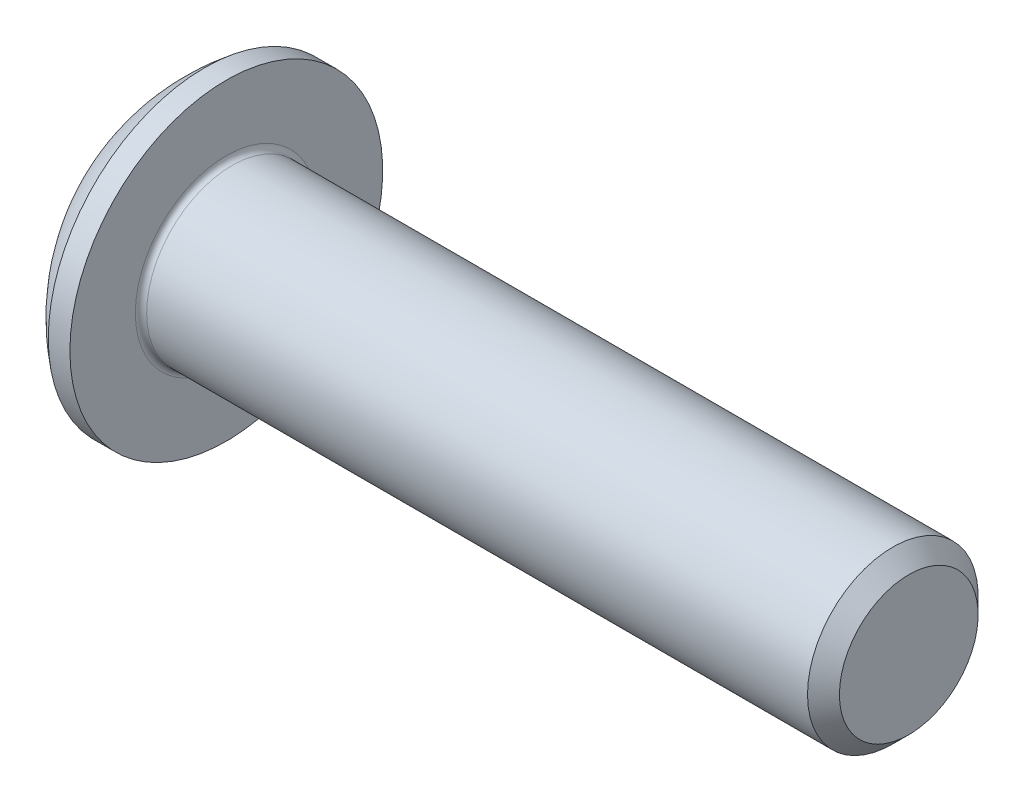
ISO-10303-21;
HEADER;
FILE_DESCRIPTION(('STEP AP214'),'2;1');
FILE_NAME('part.step','',(''),(''),'','','');
FILE_SCHEMA(('AUTOMOTIVE_DESIGN { 1 0 10303 214 1 1 1 1 }'));
ENDSEC;
DATA;
#1=APPLICATION_CONTEXT('core data for automotive mechanical design processes');
#2=APPLICATION_PROTOCOL_DEFINITION('international standard','automotive_design',2000,#1);
#3=PRODUCT_CONTEXT('',#1,'mechanical');
#4=PRODUCT('Part','Part','',(#3));
#5=PRODUCT_RELATED_PRODUCT_CATEGORY('part','',(#4));
#6=PRODUCT_DEFINITION_FORMATION('','',#4);
#7=PRODUCT_DEFINITION_CONTEXT('part definition',#1,'design');
#8=PRODUCT_DEFINITION('design','',#6,#7);
#9=PRODUCT_DEFINITION_SHAPE('','',#8);
#10=(LENGTH_UNIT() NAMED_UNIT(*) SI_UNIT(.MILLI.,.METRE.));
#11=(NAMED_UNIT(*) PLANE_ANGLE_UNIT() SI_UNIT($,.RADIAN.));
#12=(NAMED_UNIT(*) SI_UNIT($,.STERADIAN.) SOLID_ANGLE_UNIT());
#13=UNCERTAINTY_MEASURE_WITH_UNIT(LENGTH_MEASURE(1.E-05),#10,'distance_accuracy_value','');
#14=(GEOMETRIC_REPRESENTATION_CONTEXT(3) GLOBAL_UNCERTAINTY_ASSIGNED_CONTEXT((#13)) GLOBAL_UNIT_ASSIGNED_CONTEXT((#10,
#11,#12)) REPRESENTATION_CONTEXT('',''));
#15=CARTESIAN_POINT('',(0.,0.,0.));
#16=DIRECTION('',(0.,0.,1.));
#17=DIRECTION('',(1.,0.,0.));
#18=AXIS2_PLACEMENT_3D('',#15,#16,#17);
#19=CARTESIAN_POINT('',(0.,0.,0.));
#20=DIRECTION('',(-1.,0.,0.));
#21=DIRECTION('',(0.,0.,1.));
#22=AXIS2_PLACEMENT_3D('',#19,#20,#21);
#23=PLANE('',#22);
#24=CARTESIAN_POINT('',(0.,0.,0.));
#25=DIRECTION('',(-1.,0.,0.));
#26=DIRECTION('',(0.,0.,1.));
#27=AXIS2_PLACEMENT_3D('',#24,#25,#26);
#28=CIRCLE('',#27,1.375);
#29=CARTESIAN_POINT('',(0.,1.375,0.));
#30=VERTEX_POINT('',#29);
#31=EDGE_CURVE('E156',#30,#30,#28,.T.);
#32=ORIENTED_EDGE('',*,*,#31,.T.);
#33=EDGE_LOOP('',(#32));
#34=FACE_BOUND('',#33,.T.);
#35=DIRECTION('',(0.,-1.,0.));
#36=VECTOR('',#35,1.);
#37=CARTESIAN_POINT('',(0.,-0.577350269189625,0.999999999999998));
#38=LINE('',#37,#36);
#39=CARTESIAN_POINT('',(0.,0.577350269189628,1.));
#40=VERTEX_POINT('',#39);
#41=CARTESIAN_POINT('',(0.,-0.577350269189625,0.999999999999998));
#42=VERTEX_POINT('',#41);
#43=EDGE_CURVE('E51',#40,#42,#38,.T.);
#44=ORIENTED_EDGE('',*,*,#43,.T.);
#45=DIRECTION('',(0.,-0.499999999999999,-0.866025403784439));
#46=VECTOR('',#45,1.);
#47=CARTESIAN_POINT('',(0.,-1.15470053837925,0.));
#48=LINE('',#47,#46);
#49=CARTESIAN_POINT('',(0.,-1.15470053837925,0.));
#50=VERTEX_POINT('',#49);
#51=EDGE_CURVE('E276',#42,#50,#48,.T.);
#52=ORIENTED_EDGE('',*,*,#51,.T.);
#53=DIRECTION('',(0.,0.499999999999997,-0.86602540378444));
#54=VECTOR('',#53,1.);
#55=CARTESIAN_POINT('',(0.,-0.577350269189626,-1.));
#56=LINE('',#55,#54);
#57=CARTESIAN_POINT('',(0.,-0.577350269189626,-1.));
#58=VERTEX_POINT('',#57);
#59=EDGE_CURVE('E131',#50,#58,#56,.T.);
#60=ORIENTED_EDGE('',*,*,#59,.T.);
#61=DIRECTION('',(0.,1.,0.));
#62=VECTOR('',#61,1.);
#63=CARTESIAN_POINT('',(0.,0.577350269189628,-1.));
#64=LINE('',#63,#62);
#65=CARTESIAN_POINT('',(0.,0.577350269189628,-1.));
#66=VERTEX_POINT('',#65);
#67=EDGE_CURVE('E279',#58,#66,#64,.T.);
#68=ORIENTED_EDGE('',*,*,#67,.T.);
#69=DIRECTION('',(0.,0.499999999999998,0.866025403784439));
#70=VECTOR('',#69,1.);
#71=CARTESIAN_POINT('',(0.,1.15470053837925,0.));
#72=LINE('',#71,#70);
#73=CARTESIAN_POINT('',(0.,1.15470053837925,0.));
#74=VERTEX_POINT('',#73);
#75=EDGE_CURVE('E281',#66,#74,#72,.T.);
#76=ORIENTED_EDGE('',*,*,#75,.T.);
#77=DIRECTION('',(0.,-0.499999999999998,0.866025403784439));
#78=VECTOR('',#77,1.);
#79=CARTESIAN_POINT('',(0.,0.577350269189628,1.));
#80=LINE('',#79,#78);
#81=EDGE_CURVE('E283',#74,#40,#80,.T.);
#82=ORIENTED_EDGE('',*,*,#81,.T.);
#83=EDGE_LOOP('',(#44,#52,#60,#68,#76,#82));
#84=FACE_BOUND('',#83,.T.);
#85=ADVANCED_FACE('F36',(#34,#84),#23,.T.);
#86=CARTESIAN_POINT('',(3.18540887850468,0.,0.));
#87=DIRECTION('',(-1.,0.,0.));
#88=DIRECTION('',(0.,1.,0.));
#89=AXIS2_PLACEMENT_3D('',#86,#87,#88);
#90=SPHERICAL_SURFACE('',#89,3.46950352691223);
#91=CARTESIAN_POINT('',(1.07,0.,0.));
#92=DIRECTION('',(-1.,0.,0.));
#93=DIRECTION('',(0.,0.,1.));
#94=AXIS2_PLACEMENT_3D('',#91,#92,#93);
#95=CIRCLE('',#94,2.75);
#96=CARTESIAN_POINT('',(1.07,2.75,0.));
#97=VERTEX_POINT('',#96);
#98=EDGE_CURVE('E153',#97,#97,#95,.T.);
#99=CARTESIAN_POINT('',(1.07,2.75,0.));
#100=CARTESIAN_POINT('',(1.05545935022617,2.73881477308308,0.));
#101=CARTESIAN_POINT('',(1.04100742949541,2.72751420032559,0.));
#102=CARTESIAN_POINT('',(1.01228464649899,2.70468525171978,0.));
#103=CARTESIAN_POINT('',(0.998013784233334,2.69315687587146,0.));
#104=CARTESIAN_POINT('',(0.969656718546075,2.66987520967427,0.));
#105=CARTESIAN_POINT('',(0.955570515124477,2.65812191932541,0.));
#106=CARTESIAN_POINT('',(0.927586308834586,2.63439338466757,0.));
#107=CARTESIAN_POINT('',(0.913688305966292,2.62241814035859,0.));
#108=CARTESIAN_POINT('',(0.886083998409159,2.59824871005243,0.));
#109=CARTESIAN_POINT('',(0.872377693720318,2.58605452405526,0.));
#110=CARTESIAN_POINT('',(0.845160231037836,2.56145027883613,0.));
#111=CARTESIAN_POINT('',(0.831649073044194,2.54904021961419,0.));
#112=CARTESIAN_POINT('',(0.804825303401008,2.52400735043028,0.));
#113=CARTESIAN_POINT('',(0.791512691751464,2.51138454046831,0.));
#114=CARTESIAN_POINT('',(0.765089364425369,2.48592934589937,0.));
#115=CARTESIAN_POINT('',(0.751978648748819,2.47309696129241,0.));
#116=CARTESIAN_POINT('',(0.725962412214573,2.44722584623923,0.));
#117=CARTESIAN_POINT('',(0.713056891356878,2.43418711579303,0.));
#118=CARTESIAN_POINT('',(0.687454291671755,2.40790658979237,0.));
#119=CARTESIAN_POINT('',(0.674757212844327,2.39466479423792,0.));
#120=CARTESIAN_POINT('',(0.649574691985387,2.36798146984431,0.));
#121=CARTESIAN_POINT('',(0.637089249953874,2.35453994100515,0.));
#122=CARTESIAN_POINT('',(0.612333144201262,2.3274605321218,0.));
#123=CARTESIAN_POINT('',(0.600062480480163,2.31382265207761,0.));
#124=CARTESIAN_POINT('',(0.57573901882169,2.28635397226851,0.));
#125=CARTESIAN_POINT('',(0.563686220884316,2.2725231725036,0.));
#126=CARTESIAN_POINT('',(0.539801523448456,2.24467213327876,0.));
#127=CARTESIAN_POINT('',(0.527969623949971,2.23065189381883,0.));
#128=CARTESIAN_POINT('',(0.504529700465872,2.20242550289534,0.));
#129=CARTESIAN_POINT('',(0.49292167648026,2.18821935143178,0.));
#130=CARTESIAN_POINT('',(0.469932424765629,2.15962471097054,0.));
#131=CARTESIAN_POINT('',(0.458551197036611,2.14523622197286,0.));
#132=CARTESIAN_POINT('',(0.436018401513735,2.1162805267916,0.));
#133=CARTESIAN_POINT('',(0.424866833719877,2.10171332060801,0.));
#134=CARTESIAN_POINT('',(0.402796163960182,2.07240385637093,0.));
#135=CARTESIAN_POINT('',(0.391877061994345,2.05766159831744,0.));
#136=CARTESIAN_POINT('',(0.37027407129185,2.02800573970208,0.));
#137=CARTESIAN_POINT('',(0.359590182555192,2.01309213914022,0.));
#138=CARTESIAN_POINT('',(0.338460306529221,1.98309734798187,0.));
#139=CARTESIAN_POINT('',(0.328014319239908,1.96801615738538,0.));
#140=CARTESIAN_POINT('',(0.307362874467419,1.93768998079955,0.));
#141=CARTESIAN_POINT('',(0.297157416984243,1.92244499481021,0.));
#142=CARTESIAN_POINT('',(0.276989599662068,1.89179506329372,0.));
#143=CARTESIAN_POINT('',(0.26702723982307,1.87639011776656,0.));
#144=CARTESIAN_POINT('',(0.2473481244606,1.84542414327752,0.));
#145=CARTESIAN_POINT('',(0.237631368937128,1.82986311431563,0.));
#146=CARTESIAN_POINT('',(0.218445907079049,1.7985888883332,0.));
#147=CARTESIAN_POINT('',(0.208977200744443,1.78287569131266,0.));
#148=CARTESIAN_POINT('',(0.190290219726508,1.75130108287588,0.));
#149=CARTESIAN_POINT('',(0.18107194504318,1.73543967145964,0.));
#150=CARTESIAN_POINT('',(0.162888146771434,1.70357262519023,0.));
#151=CARTESIAN_POINT('',(0.153922623183016,1.68756699033706,0.));
#152=CARTESIAN_POINT('',(0.136246582973665,1.6554155244301,0.));
#153=CARTESIAN_POINT('',(0.12753606635273,1.6392696933763,0.));
#154=CARTESIAN_POINT('',(0.11037223169534,1.60684189762129,0.));
#155=CARTESIAN_POINT('',(0.101918913658883,1.59055993292007,0.));
#156=CARTESIAN_POINT('',(0.0852716034167274,1.55786396652153,0.));
#157=CARTESIAN_POINT('',(0.0770776112110277,1.54144996482421,0.));
#158=CARTESIAN_POINT('',(0.0609510133424006,1.50849405488582,0.));
#159=CARTESIAN_POINT('',(0.0530184076794733,1.49195214664476,0.));
#160=CARTESIAN_POINT('',(0.0374165826325399,1.45874458409474,0.));
#161=CARTESIAN_POINT('',(0.0297473632485339,1.44207892978578,0.));
#162=CARTESIAN_POINT('',(0.0146742263372598,1.40862807477189,0.));
#163=CARTESIAN_POINT('',(0.00727030880999163,1.39184287406696,0.));
#164=CARTESIAN_POINT('',(0.,1.375,0.));
#165=B_SPLINE_CURVE_WITH_KNOTS('',3,(#99,#100,#101,#102,#103,#104,#105,#106,#107,#108,#109,#110,
#111,#112,#113,#114,#115,#116,#117,#118,#119,#120,#121,#122,#123,#124,#125,#126,#127,#128,#129,
#130,#131,#132,#133,#134,#135,#136,#137,#138,#139,#140,#141,#142,#143,#144,#145,#146,#147,#148,
#149,#150,#151,#152,#153,#154,#155,#156,#157,#158,#159,#160,#161,#162,#163,#164),.UNSPECIFIED.,
.F.,.F.,(4,2,2,2,2,2,2,2,2,2,2,2,2,2,2,2,2,2,2,2,2,2,2,2,2,2,2,2,2,2,2,2,4),(0.,
0.055034485525685,0.110068971051371,0.165103456577055,0.22013794210274,0.275172427628426,
0.33020691315411,0.385241398679796,0.440275884205481,0.495310369731166,0.550344855256851,
0.605379340782536,0.660413826308221,0.715448311833906,0.770482797359591,0.825517282885276,
0.880551768410962,0.935586253936647,0.990620739462332,1.04565522498802,1.1006897105137,
1.15572419603939,1.21075868156507,1.26579316709076,1.32082765261644,1.37586213814213,
1.43089662366781,1.4859311091935,1.54096559471918,1.59600008024487,1.65103456577055,
1.70606905129624,1.76110353682192),.UNSPECIFIED.);
#166=EDGE_CURVE('BSEAM177',#97,#30,#165,.T.);
#167=ORIENTED_EDGE('',*,*,#98,.T.);
#168=ORIENTED_EDGE('',*,*,#31,.F.);
#169=ORIENTED_EDGE('',*,*,#166,.T.);
#170=ORIENTED_EDGE('',*,*,#166,.F.);
#171=EDGE_LOOP('',(#167,#169,#168,#170));
#172=FACE_BOUND('',#171,.T.);
#173=ADVANCED_FACE('F177',(#172),#90,.T.);
#174=CARTESIAN_POINT('',(0.,0.,0.));
#175=DIRECTION('',(-1.,0.,0.));
#176=DIRECTION('',(0.,0.,1.));
#177=AXIS2_PLACEMENT_3D('',#174,#175,#176);
#178=CYLINDRICAL_SURFACE('',#177,2.75);
#179=ORIENTED_EDGE('',*,*,#98,.F.);
#180=EDGE_LOOP('',(#179));
#181=FACE_BOUND('',#180,.T.);
#182=CARTESIAN_POINT('',(1.45,0.,0.));
#183=DIRECTION('',(-1.,0.,0.));
#184=DIRECTION('',(0.,0.,1.));
#185=AXIS2_PLACEMENT_3D('',#182,#183,#184);
#186=CIRCLE('',#185,2.75);
#187=CARTESIAN_POINT('',(1.45,0.,2.75));
#188=VERTEX_POINT('',#187);
#189=EDGE_CURVE('E150',#188,#188,#186,.T.);
#190=ORIENTED_EDGE('',*,*,#189,.T.);
#191=EDGE_LOOP('',(#190));
#192=FACE_BOUND('',#191,.T.);
#193=ADVANCED_FACE('F182',(#181,#192),#178,.T.);
#194=CARTESIAN_POINT('',(1.45,1.5,0.));
#195=DIRECTION('',(-1.,0.,0.));
#196=DIRECTION('',(0.,0.,1.));
#197=AXIS2_PLACEMENT_3D('',#194,#195,#196);
#198=PLANE('',#197);
#199=CARTESIAN_POINT('',(1.45,0.,0.));
#200=DIRECTION('',(-1.,0.,0.));
#201=DIRECTION('',(0.,0.,1.));
#202=AXIS2_PLACEMENT_3D('',#199,#200,#201);
#203=CIRCLE('',#202,1.6);
#204=CARTESIAN_POINT('',(1.45,0.,1.6));
#205=VERTEX_POINT('',#204);
#206=EDGE_CURVE('E44',#205,#205,#203,.T.);
#207=ORIENTED_EDGE('',*,*,#206,.T.);
#208=EDGE_LOOP('',(#207));
#209=FACE_BOUND('',#208,.T.);
#210=ORIENTED_EDGE('',*,*,#189,.F.);
#211=EDGE_LOOP('',(#210));
#212=FACE_BOUND('',#211,.T.);
#213=ADVANCED_FACE('F161',(#209,#212),#198,.F.);
#214=CARTESIAN_POINT('',(0.,0.,0.));
#215=DIRECTION('',(-1.,0.,0.));
#216=DIRECTION('',(0.,0.,1.));
#217=AXIS2_PLACEMENT_3D('',#214,#215,#216);
#218=CYLINDRICAL_SURFACE('',#217,1.5);
#219=CARTESIAN_POINT('',(1.55,0.,0.));
#220=DIRECTION('',(-1.,0.,0.));
#221=DIRECTION('',(0.,0.,1.));
#222=AXIS2_PLACEMENT_3D('',#219,#220,#221);
#223=CIRCLE('',#222,1.5);
#224=CARTESIAN_POINT('',(1.55,0.,1.5));
#225=VERTEX_POINT('',#224);
#226=EDGE_CURVE('E11',#225,#225,#223,.F.);
#227=ORIENTED_EDGE('',*,*,#226,.T.);
#228=EDGE_LOOP('',(#227));
#229=FACE_BOUND('',#228,.T.);
#230=CARTESIAN_POINT('',(13.1695,0.,0.));
#231=DIRECTION('',(-1.,0.,0.));
#232=DIRECTION('',(0.,0.,1.));
#233=AXIS2_PLACEMENT_3D('',#230,#231,#232);
#234=CIRCLE('',#233,1.5);
#235=CARTESIAN_POINT('',(13.1695,0.,1.5));
#236=VERTEX_POINT('',#235);
#237=EDGE_CURVE('E147',#236,#236,#234,.T.);
#238=ORIENTED_EDGE('',*,*,#237,.T.);
#239=EDGE_LOOP('',(#238));
#240=FACE_BOUND('',#239,.T.);
#241=ADVANCED_FACE('F191',(#229,#240),#218,.T.);
#242=CARTESIAN_POINT('',(13.45,0.,0.));
#243=DIRECTION('',(-1.,0.,0.));
#244=DIRECTION('',(0.,0.,1.));
#245=AXIS2_PLACEMENT_3D('',#242,#243,#244);
#246=CONICAL_SURFACE('',#245,1.2195,0.785398163397449);
#247=ORIENTED_EDGE('',*,*,#237,.F.);
#248=EDGE_LOOP('',(#247));
#249=FACE_BOUND('',#248,.T.);
#250=CARTESIAN_POINT('',(13.45,0.,0.));
#251=DIRECTION('',(-1.,0.,0.));
#252=DIRECTION('',(0.,0.,1.));
#253=AXIS2_PLACEMENT_3D('',#250,#251,#252);
#254=CIRCLE('',#253,1.2195);
#255=CARTESIAN_POINT('',(13.45,0.,1.2195));
#256=VERTEX_POINT('',#255);
#257=EDGE_CURVE('E143',#256,#256,#254,.T.);
#258=ORIENTED_EDGE('',*,*,#257,.T.);
#259=EDGE_LOOP('',(#258));
#260=FACE_BOUND('',#259,.T.);
#261=ADVANCED_FACE('F172',(#249,#260),#246,.T.);
#262=CARTESIAN_POINT('',(13.45,0.,0.));
#263=DIRECTION('',(-1.,0.,0.));
#264=DIRECTION('',(0.,0.,1.));
#265=AXIS2_PLACEMENT_3D('',#262,#263,#264);
#266=PLANE('',#265);
#267=ORIENTED_EDGE('',*,*,#257,.F.);
#268=EDGE_LOOP('',(#267));
#269=FACE_BOUND('',#268,.T.);
#270=ADVANCED_FACE('F165',(#269),#266,.F.);
#271=CARTESIAN_POINT('',(1.55,0.,0.));
#272=DIRECTION('',(-1.,0.,0.));
#273=DIRECTION('',(0.,0.,1.));
#274=AXIS2_PLACEMENT_3D('',#271,#272,#273);
#275=TOROIDAL_SURFACE('',#274,1.6,0.1);
#276=ORIENTED_EDGE('',*,*,#226,.F.);
#277=EDGE_LOOP('',(#276));
#278=FACE_BOUND('',#277,.T.);
#279=ORIENTED_EDGE('',*,*,#206,.F.);
#280=EDGE_LOOP('',(#279));
#281=FACE_BOUND('',#280,.T.);
#282=ADVANCED_FACE('F38',(#278,#281),#275,.F.);
#283=CARTESIAN_POINT('',(1.04,-1.15470053837925,0.));
#284=DIRECTION('',(0.,0.866025403784439,-0.499999999999999));
#285=DIRECTION('',(0.,0.499999999999999,0.866025403784439));
#286=AXIS2_PLACEMENT_3D('',#283,#284,#285);
#287=PLANE('',#286);
#288=DIRECTION('',(0.,-0.499999999999999,-0.866025403784439));
#289=VECTOR('',#288,1.);
#290=CARTESIAN_POINT('',(1.04,-1.15470053837925,0.));
#291=LINE('',#290,#289);
#292=CARTESIAN_POINT('',(1.04,-0.577350269189625,0.999999999999998));
#293=VERTEX_POINT('',#292);
#294=CARTESIAN_POINT('',(1.04,-0.866025403784437,0.499999999999998));
#295=VERTEX_POINT('',#294);
#296=EDGE_CURVE('E117',#293,#295,#291,.T.);
#297=ORIENTED_EDGE('',*,*,#296,.T.);
#298=CARTESIAN_POINT('',(1.04,-1.15470053837925,0.));
#299=VERTEX_POINT('',#298);
#300=EDGE_CURVE('E112',#295,#299,#291,.T.);
#301=ORIENTED_EDGE('',*,*,#300,.T.);
#302=DIRECTION('',(-1.,0.,0.));
#303=VECTOR('',#302,1.);
#304=CARTESIAN_POINT('',(1.04,-1.15470053837925,0.));
#305=LINE('',#304,#303);
#306=EDGE_CURVE('E114',#299,#50,#305,.T.);
#307=ORIENTED_EDGE('',*,*,#306,.T.);
#308=ORIENTED_EDGE('',*,*,#51,.F.);
#309=DIRECTION('',(-1.,0.,0.));
#310=VECTOR('',#309,1.);
#311=CARTESIAN_POINT('',(1.04,-0.577350269189625,0.999999999999998));
#312=LINE('',#311,#310);
#313=EDGE_CURVE('E272',#293,#42,#312,.T.);
#314=ORIENTED_EDGE('',*,*,#313,.F.);
#315=EDGE_LOOP('',(#297,#301,#307,#308,#314));
#316=FACE_BOUND('',#315,.T.);
#317=ADVANCED_FACE('F113',(#316),#287,.T.);
#318=CARTESIAN_POINT('',(1.04,-0.577350269189626,-1.));
#319=DIRECTION('',(0.,0.86602540378444,0.499999999999998));
#320=DIRECTION('',(0.,-0.499999999999998,0.86602540378444));
#321=AXIS2_PLACEMENT_3D('',#318,#319,#320);
#322=PLANE('',#321);
#323=DIRECTION('',(0.,0.499999999999997,-0.86602540378444));
#324=VECTOR('',#323,1.);
#325=CARTESIAN_POINT('',(1.04,-0.577350269189626,-1.));
#326=LINE('',#325,#324);
#327=CARTESIAN_POINT('',(1.04,-0.86602540378444,-0.499999999999997));
#328=VERTEX_POINT('',#327);
#329=EDGE_CURVE('E59',#299,#328,#326,.T.);
#330=ORIENTED_EDGE('',*,*,#329,.T.);
#331=CARTESIAN_POINT('',(1.04,-0.577350269189626,-1.));
#332=VERTEX_POINT('',#331);
#333=EDGE_CURVE('E126',#328,#332,#326,.T.);
#334=ORIENTED_EDGE('',*,*,#333,.T.);
#335=DIRECTION('',(-1.,0.,0.));
#336=VECTOR('',#335,1.);
#337=CARTESIAN_POINT('',(1.04,-0.577350269189626,-1.));
#338=LINE('',#337,#336);
#339=EDGE_CURVE('E133',#332,#58,#338,.T.);
#340=ORIENTED_EDGE('',*,*,#339,.T.);
#341=ORIENTED_EDGE('',*,*,#59,.F.);
#342=ORIENTED_EDGE('',*,*,#306,.F.);
#343=EDGE_LOOP('',(#330,#334,#340,#341,#342));
#344=FACE_BOUND('',#343,.T.);
#345=ADVANCED_FACE('F129',(#344),#322,.T.);
#346=CARTESIAN_POINT('',(1.04,0.577350269189628,-1.));
#347=DIRECTION('',(0.,0.,1.));
#348=DIRECTION('',(0.,-1.,0.));
#349=AXIS2_PLACEMENT_3D('',#346,#347,#348);
#350=PLANE('',#349);
#351=DIRECTION('',(0.,1.,0.));
#352=VECTOR('',#351,1.);
#353=CARTESIAN_POINT('',(1.04,0.577350269189628,-1.));
#354=LINE('',#353,#352);
#355=CARTESIAN_POINT('',(1.04,0.,-1.));
#356=VERTEX_POINT('',#355);
#357=EDGE_CURVE('E253',#332,#356,#354,.T.);
#358=ORIENTED_EDGE('',*,*,#357,.T.);
#359=CARTESIAN_POINT('',(1.04,0.577350269189628,-1.));
#360=VERTEX_POINT('',#359);
#361=EDGE_CURVE('E125',#356,#360,#354,.T.);
#362=ORIENTED_EDGE('',*,*,#361,.T.);
#363=DIRECTION('',(-1.,0.,0.));
#364=VECTOR('',#363,1.);
#365=CARTESIAN_POINT('',(1.04,0.577350269189628,-1.));
#366=LINE('',#365,#364);
#367=EDGE_CURVE('E138',#360,#66,#366,.T.);
#368=ORIENTED_EDGE('',*,*,#367,.T.);
#369=ORIENTED_EDGE('',*,*,#67,.F.);
#370=ORIENTED_EDGE('',*,*,#339,.F.);
#371=EDGE_LOOP('',(#358,#362,#368,#369,#370));
#372=FACE_BOUND('',#371,.T.);
#373=ADVANCED_FACE('F205',(#372),#350,.T.);
#374=CARTESIAN_POINT('',(1.04,1.15470053837925,0.));
#375=DIRECTION('',(0.,-0.86602540378444,0.499999999999998));
#376=DIRECTION('',(0.,-0.499999999999998,-0.86602540378444));
#377=AXIS2_PLACEMENT_3D('',#374,#375,#376);
#378=PLANE('',#377);
#379=DIRECTION('',(0.,0.499999999999998,0.866025403784439));
#380=VECTOR('',#379,1.);
#381=CARTESIAN_POINT('',(1.04,1.15470053837925,0.));
#382=LINE('',#381,#380);
#383=CARTESIAN_POINT('',(1.04,0.86602540378444,-0.499999999999999));
#384=VERTEX_POINT('',#383);
#385=EDGE_CURVE('E242',#360,#384,#382,.T.);
#386=ORIENTED_EDGE('',*,*,#385,.T.);
#387=CARTESIAN_POINT('',(1.04,1.15470053837925,0.));
#388=VERTEX_POINT('',#387);
#389=EDGE_CURVE('E247',#384,#388,#382,.T.);
#390=ORIENTED_EDGE('',*,*,#389,.T.);
#391=DIRECTION('',(-1.,0.,0.));
#392=VECTOR('',#391,1.);
#393=CARTESIAN_POINT('',(1.04,1.15470053837925,0.));
#394=LINE('',#393,#392);
#395=EDGE_CURVE('E287',#388,#74,#394,.T.);
#396=ORIENTED_EDGE('',*,*,#395,.T.);
#397=ORIENTED_EDGE('',*,*,#75,.F.);
#398=ORIENTED_EDGE('',*,*,#367,.F.);
#399=EDGE_LOOP('',(#386,#390,#396,#397,#398));
#400=FACE_BOUND('',#399,.T.);
#401=ADVANCED_FACE('F208',(#400),#378,.T.);
#402=CARTESIAN_POINT('',(1.04,0.577350269189628,1.));
#403=DIRECTION('',(0.,-0.86602540378444,-0.499999999999998));
#404=DIRECTION('',(0.,0.499999999999998,-0.86602540378444));
#405=AXIS2_PLACEMENT_3D('',#402,#403,#404);
#406=PLANE('',#405);
#407=DIRECTION('',(0.,-0.499999999999998,0.866025403784439));
#408=VECTOR('',#407,1.);
#409=CARTESIAN_POINT('',(1.04,0.577350269189628,1.));
#410=LINE('',#409,#408);
#411=CARTESIAN_POINT('',(1.04,0.86602540378444,0.499999999999999));
#412=VERTEX_POINT('',#411);
#413=EDGE_CURVE('E250',#388,#412,#410,.T.);
#414=ORIENTED_EDGE('',*,*,#413,.T.);
#415=CARTESIAN_POINT('',(1.04,0.577350269189628,1.));
#416=VERTEX_POINT('',#415);
#417=EDGE_CURVE('E258',#412,#416,#410,.T.);
#418=ORIENTED_EDGE('',*,*,#417,.T.);
#419=DIRECTION('',(-1.,0.,0.));
#420=VECTOR('',#419,1.);
#421=CARTESIAN_POINT('',(1.04,0.577350269189628,1.));
#422=LINE('',#421,#420);
#423=EDGE_CURVE('E271',#416,#40,#422,.T.);
#424=ORIENTED_EDGE('',*,*,#423,.T.);
#425=ORIENTED_EDGE('',*,*,#81,.F.);
#426=ORIENTED_EDGE('',*,*,#395,.F.);
#427=EDGE_LOOP('',(#414,#418,#424,#425,#426));
#428=FACE_BOUND('',#427,.T.);
#429=ADVANCED_FACE('F212',(#428),#406,.T.);
#430=CARTESIAN_POINT('',(1.04,-0.577350269189625,0.999999999999998));
#431=DIRECTION('',(0.,0.,-1.));
#432=DIRECTION('',(0.,1.,0.));
#433=AXIS2_PLACEMENT_3D('',#430,#431,#432);
#434=PLANE('',#433);
#435=DIRECTION('',(0.,-1.,0.));
#436=VECTOR('',#435,1.);
#437=CARTESIAN_POINT('',(1.04,-0.577350269189625,0.999999999999998));
#438=LINE('',#437,#436);
#439=CARTESIAN_POINT('',(1.04,0.,1.));
#440=VERTEX_POINT('',#439);
#441=EDGE_CURVE('E264',#416,#440,#438,.T.);
#442=ORIENTED_EDGE('',*,*,#441,.T.);
#443=EDGE_CURVE('E266',#440,#293,#438,.T.);
#444=ORIENTED_EDGE('',*,*,#443,.T.);
#445=ORIENTED_EDGE('',*,*,#313,.T.);
#446=ORIENTED_EDGE('',*,*,#43,.F.);
#447=ORIENTED_EDGE('',*,*,#423,.F.);
#448=EDGE_LOOP('',(#442,#444,#445,#446,#447));
#449=FACE_BOUND('',#448,.T.);
#450=ADVANCED_FACE('F216',(#449),#434,.T.);
#451=CARTESIAN_POINT('',(1.04,-1.73205080756887,-0.999999999999999));
#452=DIRECTION('',(1.,0.,0.));
#453=DIRECTION('',(0.,0.,-1.));
#454=AXIS2_PLACEMENT_3D('',#451,#452,#453);
#455=PLANE('',#454);
#456=CARTESIAN_POINT('',(1.04,0.,0.));
#457=DIRECTION('',(-1.,0.,0.));
#458=DIRECTION('',(0.,0.,1.));
#459=AXIS2_PLACEMENT_3D('',#456,#457,#458);
#460=CIRCLE('',#459,1.);
#461=EDGE_CURVE('E239',#384,#356,#460,.T.);
#462=ORIENTED_EDGE('',*,*,#461,.F.);
#463=ORIENTED_EDGE('',*,*,#385,.F.);
#464=ORIENTED_EDGE('',*,*,#361,.F.);
#465=EDGE_LOOP('',(#462,#463,#464));
#466=FACE_BOUND('',#465,.T.);
#467=ADVANCED_FACE('F220',(#466),#455,.F.);
#468=EDGE_CURVE('E144',#412,#384,#460,.T.);
#469=ORIENTED_EDGE('',*,*,#468,.F.);
#470=ORIENTED_EDGE('',*,*,#413,.F.);
#471=ORIENTED_EDGE('',*,*,#389,.F.);
#472=EDGE_LOOP('',(#469,#470,#471));
#473=FACE_BOUND('',#472,.T.);
#474=ADVANCED_FACE('F229',(#473),#455,.F.);
#475=EDGE_CURVE('E137',#440,#412,#460,.T.);
#476=ORIENTED_EDGE('',*,*,#475,.F.);
#477=ORIENTED_EDGE('',*,*,#441,.F.);
#478=ORIENTED_EDGE('',*,*,#417,.F.);
#479=EDGE_LOOP('',(#476,#477,#478));
#480=FACE_BOUND('',#479,.T.);
#481=ADVANCED_FACE('F234',(#480),#455,.F.);
#482=EDGE_CURVE('E132',#295,#440,#460,.T.);
#483=ORIENTED_EDGE('',*,*,#482,.F.);
#484=ORIENTED_EDGE('',*,*,#296,.F.);
#485=ORIENTED_EDGE('',*,*,#443,.F.);
#486=EDGE_LOOP('',(#483,#484,#485));
#487=FACE_BOUND('',#486,.T.);
#488=ADVANCED_FACE('F227',(#487),#455,.F.);
#489=EDGE_CURVE('E123',#328,#295,#460,.T.);
#490=ORIENTED_EDGE('',*,*,#489,.F.);
#491=ORIENTED_EDGE('',*,*,#329,.F.);
#492=ORIENTED_EDGE('',*,*,#300,.F.);
#493=EDGE_LOOP('',(#490,#491,#492));
#494=FACE_BOUND('',#493,.T.);
#495=ADVANCED_FACE('F122',(#494),#455,.F.);
#496=EDGE_CURVE('E245',#356,#328,#460,.T.);
#497=ORIENTED_EDGE('',*,*,#496,.F.);
#498=ORIENTED_EDGE('',*,*,#357,.F.);
#499=ORIENTED_EDGE('',*,*,#333,.F.);
#500=EDGE_LOOP('',(#497,#498,#499));
#501=FACE_BOUND('',#500,.T.);
#502=ADVANCED_FACE('F200',(#501),#455,.F.);
#503=CARTESIAN_POINT('',(1.61735026918963,0.,0.));
#504=DIRECTION('',(-1.,0.,0.));
#505=DIRECTION('',(0.,0.,1.));
#506=AXIS2_PLACEMENT_3D('',#503,#504,#505);
#507=CONICAL_SURFACE('',#506,0.,1.04719755119659);
#508=ORIENTED_EDGE('',*,*,#475,.T.);
#509=ORIENTED_EDGE('',*,*,#468,.T.);
#510=ORIENTED_EDGE('',*,*,#461,.T.);
#511=ORIENTED_EDGE('',*,*,#496,.T.);
#512=ORIENTED_EDGE('',*,*,#489,.T.);
#513=ORIENTED_EDGE('',*,*,#482,.T.);
#514=EDGE_LOOP('',(#508,#509,#510,#511,#512,#513));
#515=FACE_BOUND('',#514,.T.);
#516=CARTESIAN_POINT('',(1.61735026918963,0.,0.));
#517=VERTEX_POINT('',#516);
#518=VERTEX_LOOP('',#517);
#519=FACE_BOUND('',#518,.T.);
#520=ADVANCED_FACE('F198',(#515,#519),#507,.F.);
#521=CLOSED_SHELL('',(#85,#173,#193,#213,#241,#261,#270,#282,#317,#345,#373,#401,#429,#450,#467,
#474,#481,#488,#495,#502,#520));
#522=MANIFOLD_SOLID_BREP('B2',#521);
#523=ADVANCED_BREP_SHAPE_REPRESENTATION('',(#18,#522),#14);
#524=SHAPE_DEFINITION_REPRESENTATION(#9,#523);
ENDSEC;
END-ISO-10303-21;
